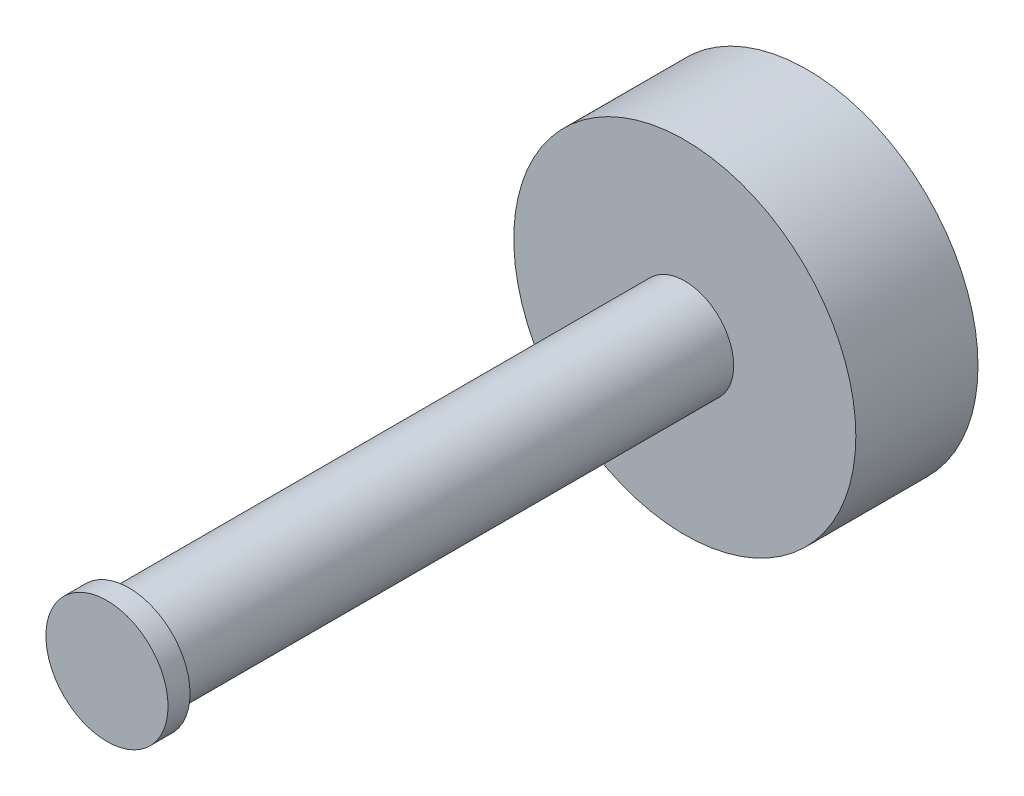
ISO-10303-21;
HEADER;
FILE_DESCRIPTION(('STEP AP214'),'2;1');
FILE_NAME('part.step','',(''),(''),'','','');
FILE_SCHEMA(('AUTOMOTIVE_DESIGN { 1 0 10303 214 1 1 1 1 }'));
ENDSEC;
DATA;
#1=APPLICATION_CONTEXT('core data for automotive mechanical design processes');
#2=APPLICATION_PROTOCOL_DEFINITION('international standard','automotive_design',2000,#1);
#3=PRODUCT_CONTEXT('',#1,'mechanical');
#4=PRODUCT('Part','Part','',(#3));
#5=PRODUCT_RELATED_PRODUCT_CATEGORY('part','',(#4));
#6=PRODUCT_DEFINITION_FORMATION('','',#4);
#7=PRODUCT_DEFINITION_CONTEXT('part definition',#1,'design');
#8=PRODUCT_DEFINITION('design','',#6,#7);
#9=PRODUCT_DEFINITION_SHAPE('','',#8);
#10=(LENGTH_UNIT() NAMED_UNIT(*) SI_UNIT(.MILLI.,.METRE.));
#11=(NAMED_UNIT(*) PLANE_ANGLE_UNIT() SI_UNIT($,.RADIAN.));
#12=(NAMED_UNIT(*) SI_UNIT($,.STERADIAN.) SOLID_ANGLE_UNIT());
#13=UNCERTAINTY_MEASURE_WITH_UNIT(LENGTH_MEASURE(1.E-05),#10,'distance_accuracy_value','');
#14=(GEOMETRIC_REPRESENTATION_CONTEXT(3) GLOBAL_UNCERTAINTY_ASSIGNED_CONTEXT((#13)) GLOBAL_UNIT_ASSIGNED_CONTEXT((#10,
#11,#12)) REPRESENTATION_CONTEXT('',''));
#15=CARTESIAN_POINT('',(0.,0.,0.));
#16=DIRECTION('',(0.,0.,1.));
#17=DIRECTION('',(1.,0.,0.));
#18=AXIS2_PLACEMENT_3D('',#15,#16,#17);
#19=CARTESIAN_POINT('',(0.,0.,10.));
#20=DIRECTION('',(0.,0.,-1.));
#21=DIRECTION('',(-1.,0.,0.));
#22=AXIS2_PLACEMENT_3D('',#19,#20,#21);
#23=CYLINDRICAL_SURFACE('',#22,14.);
#24=CARTESIAN_POINT('',(0.,0.,10.));
#25=DIRECTION('',(0.,0.,1.));
#26=DIRECTION('',(1.,0.,0.));
#27=AXIS2_PLACEMENT_3D('',#24,#25,#26);
#28=CIRCLE('',#27,14.);
#29=CARTESIAN_POINT('',(14.,0.,10.));
#30=VERTEX_POINT('',#29);
#31=EDGE_CURVE('E45',#30,#30,#28,.T.);
#32=ORIENTED_EDGE('',*,*,#31,.F.);
#33=EDGE_LOOP('',(#32));
#34=FACE_BOUND('',#33,.T.);
#35=CARTESIAN_POINT('',(0.,0.,0.));
#36=DIRECTION('',(0.,0.,1.));
#37=DIRECTION('',(1.,0.,0.));
#38=AXIS2_PLACEMENT_3D('',#35,#36,#37);
#39=CIRCLE('',#38,14.);
#40=CARTESIAN_POINT('',(14.,0.,0.));
#41=VERTEX_POINT('',#40);
#42=EDGE_CURVE('E51',#41,#41,#39,.T.);
#43=ORIENTED_EDGE('',*,*,#42,.T.);
#44=EDGE_LOOP('',(#43));
#45=FACE_BOUND('',#44,.T.);
#46=ADVANCED_FACE('F37',(#34,#45),#23,.T.);
#47=CARTESIAN_POINT('',(0.,0.,10.));
#48=DIRECTION('',(0.,0.,1.));
#49=DIRECTION('',(1.,0.,0.));
#50=AXIS2_PLACEMENT_3D('',#47,#48,#49);
#51=PLANE('',#50);
#52=CARTESIAN_POINT('',(0.,0.,10.));
#53=DIRECTION('',(0.,0.,1.));
#54=DIRECTION('',(1.,0.,0.));
#55=AXIS2_PLACEMENT_3D('',#52,#53,#54);
#56=CIRCLE('',#55,4.);
#57=CARTESIAN_POINT('',(4.,0.,10.));
#58=VERTEX_POINT('',#57);
#59=EDGE_CURVE('E10',#58,#58,#56,.T.);
#60=ORIENTED_EDGE('',*,*,#59,.F.);
#61=EDGE_LOOP('',(#60));
#62=FACE_BOUND('',#61,.T.);
#63=ORIENTED_EDGE('',*,*,#31,.T.);
#64=EDGE_LOOP('',(#63));
#65=FACE_BOUND('',#64,.T.);
#66=ADVANCED_FACE('F76',(#62,#65),#51,.T.);
#67=CARTESIAN_POINT('',(0.,0.,0.));
#68=DIRECTION('',(0.,0.,1.));
#69=DIRECTION('',(1.,0.,0.));
#70=AXIS2_PLACEMENT_3D('',#67,#68,#69);
#71=PLANE('',#70);
#72=CARTESIAN_POINT('',(0.,0.,0.));
#73=DIRECTION('',(0.,0.,-1.));
#74=DIRECTION('',(-1.,0.,0.));
#75=AXIS2_PLACEMENT_3D('',#72,#73,#74);
#76=CIRCLE('',#75,5.);
#77=CARTESIAN_POINT('',(-5.,0.,0.));
#78=VERTEX_POINT('',#77);
#79=EDGE_CURVE('E61',#78,#78,#76,.T.);
#80=ORIENTED_EDGE('',*,*,#79,.F.);
#81=EDGE_LOOP('',(#80));
#82=FACE_BOUND('',#81,.T.);
#83=ORIENTED_EDGE('',*,*,#42,.F.);
#84=EDGE_LOOP('',(#83));
#85=FACE_BOUND('',#84,.T.);
#86=ADVANCED_FACE('F73',(#82,#85),#71,.F.);
#87=CARTESIAN_POINT('',(0.,0.,1.8));
#88=DIRECTION('',(0.,0.,-1.));
#89=DIRECTION('',(-1.,0.,0.));
#90=AXIS2_PLACEMENT_3D('',#87,#88,#89);
#91=PLANE('',#90);
#92=CARTESIAN_POINT('',(0.,0.,1.8));
#93=DIRECTION('',(0.,0.,-1.));
#94=DIRECTION('',(-1.,0.,0.));
#95=AXIS2_PLACEMENT_3D('',#92,#93,#94);
#96=CIRCLE('',#95,5.);
#97=CARTESIAN_POINT('',(-5.,0.,1.8));
#98=VERTEX_POINT('',#97);
#99=EDGE_CURVE('E57',#98,#98,#96,.T.);
#100=ORIENTED_EDGE('',*,*,#99,.T.);
#101=EDGE_LOOP('',(#100));
#102=FACE_BOUND('',#101,.T.);
#103=CARTESIAN_POINT('',(0.,0.,1.8));
#104=DIRECTION('',(0.,0.,-1.));
#105=DIRECTION('',(-1.,0.,0.));
#106=AXIS2_PLACEMENT_3D('',#103,#104,#105);
#107=CIRCLE('',#106,2.25);
#108=CARTESIAN_POINT('',(-2.25,0.,1.8));
#109=VERTEX_POINT('',#108);
#110=EDGE_CURVE('E40',#109,#109,#107,.F.);
#111=ORIENTED_EDGE('',*,*,#110,.T.);
#112=EDGE_LOOP('',(#111));
#113=FACE_BOUND('',#112,.T.);
#114=ADVANCED_FACE('F75',(#102,#113),#91,.T.);
#115=CARTESIAN_POINT('',(0.,0.,1.8));
#116=DIRECTION('',(0.,0.,-1.));
#117=DIRECTION('',(-1.,0.,0.));
#118=AXIS2_PLACEMENT_3D('',#115,#116,#117);
#119=CYLINDRICAL_SURFACE('',#118,5.);
#120=ORIENTED_EDGE('',*,*,#99,.F.);
#121=EDGE_LOOP('',(#120));
#122=FACE_BOUND('',#121,.T.);
#123=ORIENTED_EDGE('',*,*,#79,.T.);
#124=EDGE_LOOP('',(#123));
#125=FACE_BOUND('',#124,.T.);
#126=ADVANCED_FACE('F82',(#122,#125),#119,.F.);
#127=CARTESIAN_POINT('',(0.,0.,5.));
#128=DIRECTION('',(0.,0.,-1.));
#129=DIRECTION('',(-1.,0.,0.));
#130=AXIS2_PLACEMENT_3D('',#127,#128,#129);
#131=PLANE('',#130);
#132=CARTESIAN_POINT('',(0.,0.,5.));
#133=DIRECTION('',(0.,0.,-1.));
#134=DIRECTION('',(-1.,0.,0.));
#135=AXIS2_PLACEMENT_3D('',#132,#133,#134);
#136=CIRCLE('',#135,2.25);
#137=CARTESIAN_POINT('',(-2.25,0.,5.));
#138=VERTEX_POINT('',#137);
#139=EDGE_CURVE('E65',#138,#138,#136,.T.);
#140=ORIENTED_EDGE('',*,*,#139,.T.);
#141=EDGE_LOOP('',(#140));
#142=FACE_BOUND('',#141,.T.);
#143=ADVANCED_FACE('F156',(#142),#131,.T.);
#144=CARTESIAN_POINT('',(0.,0.,5.));
#145=DIRECTION('',(0.,0.,-1.));
#146=DIRECTION('',(-1.,0.,0.));
#147=AXIS2_PLACEMENT_3D('',#144,#145,#146);
#148=CYLINDRICAL_SURFACE('',#147,2.25);
#149=ORIENTED_EDGE('',*,*,#139,.F.);
#150=EDGE_LOOP('',(#149));
#151=FACE_BOUND('',#150,.T.);
#152=ORIENTED_EDGE('',*,*,#110,.F.);
#153=EDGE_LOOP('',(#152));
#154=FACE_BOUND('',#153,.T.);
#155=ADVANCED_FACE('F106',(#151,#154),#148,.F.);
#156=CARTESIAN_POINT('',(0.,0.,55.5));
#157=DIRECTION('',(0.,0.,-1.));
#158=DIRECTION('',(-1.,0.,0.));
#159=AXIS2_PLACEMENT_3D('',#156,#157,#158);
#160=CYLINDRICAL_SURFACE('',#159,4.);
#161=CARTESIAN_POINT('',(0.,0.,55.5));
#162=DIRECTION('',(0.,0.,1.));
#163=DIRECTION('',(1.,0.,0.));
#164=AXIS2_PLACEMENT_3D('',#161,#162,#163);
#165=CIRCLE('',#164,4.);
#166=CARTESIAN_POINT('',(4.,0.,55.5));
#167=VERTEX_POINT('',#166);
#168=EDGE_CURVE('E55',#167,#167,#165,.T.);
#169=ORIENTED_EDGE('',*,*,#168,.F.);
#170=EDGE_LOOP('',(#169));
#171=FACE_BOUND('',#170,.T.);
#172=ORIENTED_EDGE('',*,*,#59,.T.);
#173=EDGE_LOOP('',(#172));
#174=FACE_BOUND('',#173,.T.);
#175=ADVANCED_FACE('F111',(#171,#174),#160,.T.);
#176=CARTESIAN_POINT('',(0.,0.,57.3));
#177=DIRECTION('',(0.,0.,-1.));
#178=DIRECTION('',(-1.,0.,0.));
#179=AXIS2_PLACEMENT_3D('',#176,#177,#178);
#180=CYLINDRICAL_SURFACE('',#179,5.);
#181=CARTESIAN_POINT('',(0.,0.,57.3));
#182=DIRECTION('',(0.,0.,1.));
#183=DIRECTION('',(1.,0.,0.));
#184=AXIS2_PLACEMENT_3D('',#181,#182,#183);
#185=CIRCLE('',#184,5.);
#186=CARTESIAN_POINT('',(5.,0.,57.3));
#187=VERTEX_POINT('',#186);
#188=EDGE_CURVE('E171',#187,#187,#185,.T.);
#189=ORIENTED_EDGE('',*,*,#188,.F.);
#190=EDGE_LOOP('',(#189));
#191=FACE_BOUND('',#190,.T.);
#192=CARTESIAN_POINT('',(0.,0.,55.5));
#193=DIRECTION('',(0.,0.,1.));
#194=DIRECTION('',(1.,0.,0.));
#195=AXIS2_PLACEMENT_3D('',#192,#193,#194);
#196=CIRCLE('',#195,5.);
#197=CARTESIAN_POINT('',(5.,0.,55.5));
#198=VERTEX_POINT('',#197);
#199=EDGE_CURVE('E174',#198,#198,#196,.T.);
#200=ORIENTED_EDGE('',*,*,#199,.T.);
#201=EDGE_LOOP('',(#200));
#202=FACE_BOUND('',#201,.T.);
#203=ADVANCED_FACE('F116',(#191,#202),#180,.T.);
#204=CARTESIAN_POINT('',(0.,0.,57.3));
#205=DIRECTION('',(0.,0.,1.));
#206=DIRECTION('',(1.,0.,0.));
#207=AXIS2_PLACEMENT_3D('',#204,#205,#206);
#208=PLANE('',#207);
#209=ORIENTED_EDGE('',*,*,#188,.T.);
#210=EDGE_LOOP('',(#209));
#211=FACE_BOUND('',#210,.T.);
#212=ADVANCED_FACE('F127',(#211),#208,.T.);
#213=CARTESIAN_POINT('',(0.,0.,55.5));
#214=DIRECTION('',(0.,0.,1.));
#215=DIRECTION('',(1.,0.,0.));
#216=AXIS2_PLACEMENT_3D('',#213,#214,#215);
#217=PLANE('',#216);
#218=ORIENTED_EDGE('',*,*,#168,.T.);
#219=EDGE_LOOP('',(#218));
#220=FACE_BOUND('',#219,.T.);
#221=ORIENTED_EDGE('',*,*,#199,.F.);
#222=EDGE_LOOP('',(#221));
#223=FACE_BOUND('',#222,.T.);
#224=ADVANCED_FACE('F137',(#220,#223),#217,.F.);
#225=CLOSED_SHELL('',(#46,#66,#86,#114,#126,#143,#155,#175,#203,#212,#224));
#226=MANIFOLD_SOLID_BREP('B2',#225);
#227=ADVANCED_BREP_SHAPE_REPRESENTATION('',(#18,#226),#14);
#228=SHAPE_DEFINITION_REPRESENTATION(#9,#227);
ENDSEC;
END-ISO-10303-21;
